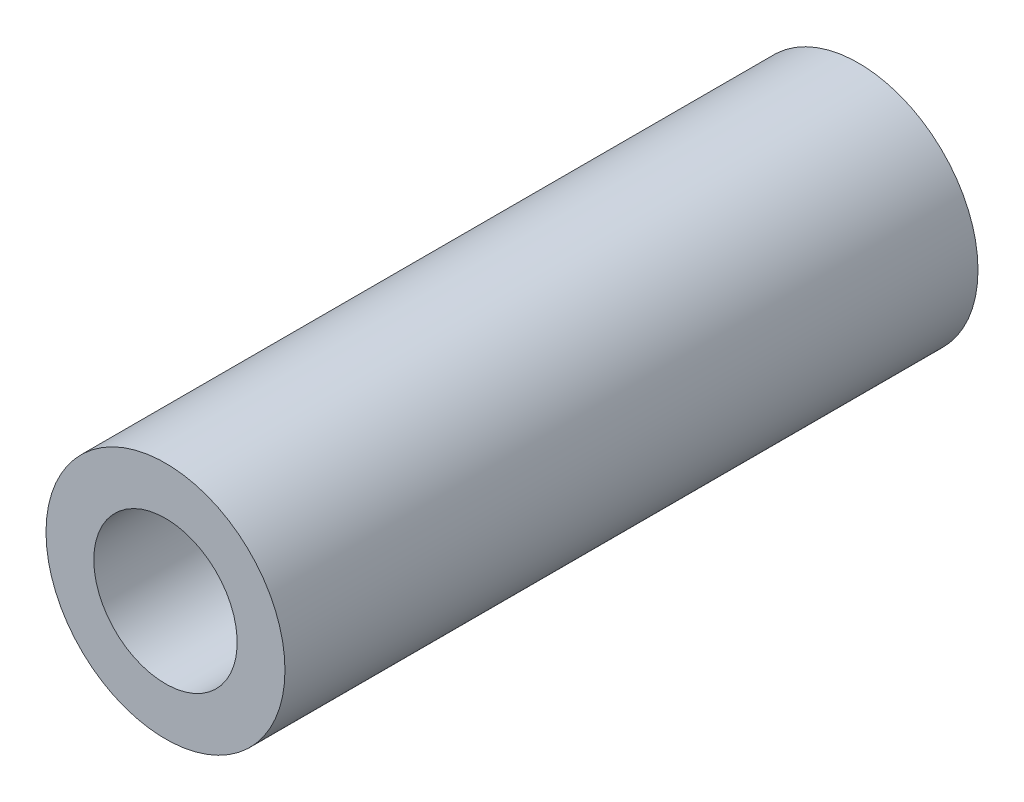
ISO-10303-21;
HEADER;
FILE_DESCRIPTION(('STEP AP214'),'2;1');
FILE_NAME('part.step','',(''),(''),'','','');
FILE_SCHEMA(('AUTOMOTIVE_DESIGN { 1 0 10303 214 1 1 1 1 }'));
ENDSEC;
DATA;
#1=APPLICATION_CONTEXT('core data for automotive mechanical design processes');
#2=APPLICATION_PROTOCOL_DEFINITION('international standard','automotive_design',2000,#1);
#3=PRODUCT_CONTEXT('',#1,'mechanical');
#4=PRODUCT('Part','Part','',(#3));
#5=PRODUCT_RELATED_PRODUCT_CATEGORY('part','',(#4));
#6=PRODUCT_DEFINITION_FORMATION('','',#4);
#7=PRODUCT_DEFINITION_CONTEXT('part definition',#1,'design');
#8=PRODUCT_DEFINITION('design','',#6,#7);
#9=PRODUCT_DEFINITION_SHAPE('','',#8);
#10=(LENGTH_UNIT() NAMED_UNIT(*) SI_UNIT(.MILLI.,.METRE.));
#11=(NAMED_UNIT(*) PLANE_ANGLE_UNIT() SI_UNIT($,.RADIAN.));
#12=(NAMED_UNIT(*) SI_UNIT($,.STERADIAN.) SOLID_ANGLE_UNIT());
#13=UNCERTAINTY_MEASURE_WITH_UNIT(LENGTH_MEASURE(1.E-05),#10,'distance_accuracy_value','');
#14=(GEOMETRIC_REPRESENTATION_CONTEXT(3) GLOBAL_UNCERTAINTY_ASSIGNED_CONTEXT((#13)) GLOBAL_UNIT_ASSIGNED_CONTEXT((#10,
#11,#12)) REPRESENTATION_CONTEXT('',''));
#15=CARTESIAN_POINT('',(0.,0.,0.));
#16=DIRECTION('',(0.,0.,1.));
#17=DIRECTION('',(1.,0.,0.));
#18=AXIS2_PLACEMENT_3D('',#15,#16,#17);
#19=CARTESIAN_POINT('',(0.,0.,29.));
#20=DIRECTION('',(0.,0.,1.));
#21=DIRECTION('',(1.,0.,0.));
#22=AXIS2_PLACEMENT_3D('',#19,#20,#21);
#23=PLANE('',#22);
#24=CARTESIAN_POINT('',(0.,0.,29.));
#25=DIRECTION('',(0.,0.,1.));
#26=DIRECTION('',(1.,0.,0.));
#27=AXIS2_PLACEMENT_3D('',#24,#25,#26);
#28=CIRCLE('',#27,5.);
#29=CARTESIAN_POINT('',(-5.,0.,29.));
#30=VERTEX_POINT('',#29);
#31=EDGE_CURVE('E10',#30,#30,#28,.T.);
#32=ORIENTED_EDGE('',*,*,#31,.T.);
#33=EDGE_LOOP('',(#32));
#34=FACE_BOUND('',#33,.T.);
#35=CARTESIAN_POINT('',(0.,0.,29.));
#36=DIRECTION('',(0.,0.,1.));
#37=DIRECTION('',(1.,0.,0.));
#38=AXIS2_PLACEMENT_3D('',#35,#36,#37);
#39=CIRCLE('',#38,3.);
#40=CARTESIAN_POINT('',(-3.,0.,29.));
#41=VERTEX_POINT('',#40);
#42=EDGE_CURVE('E52',#41,#41,#39,.T.);
#43=ORIENTED_EDGE('',*,*,#42,.F.);
#44=EDGE_LOOP('',(#43));
#45=FACE_BOUND('',#44,.T.);
#46=ADVANCED_FACE('F38',(#34,#45),#23,.T.);
#47=CARTESIAN_POINT('',(0.,0.,0.));
#48=DIRECTION('',(0.,0.,1.));
#49=DIRECTION('',(1.,0.,0.));
#50=AXIS2_PLACEMENT_3D('',#47,#48,#49);
#51=PLANE('',#50);
#52=CARTESIAN_POINT('',(0.,0.,0.));
#53=DIRECTION('',(0.,0.,1.));
#54=DIRECTION('',(1.,0.,0.));
#55=AXIS2_PLACEMENT_3D('',#52,#53,#54);
#56=CIRCLE('',#55,5.);
#57=CARTESIAN_POINT('',(-5.,0.,0.));
#58=VERTEX_POINT('',#57);
#59=EDGE_CURVE('E42',#58,#58,#56,.T.);
#60=ORIENTED_EDGE('',*,*,#59,.F.);
#61=EDGE_LOOP('',(#60));
#62=FACE_BOUND('',#61,.T.);
#63=CARTESIAN_POINT('',(0.,0.,0.));
#64=DIRECTION('',(0.,0.,1.));
#65=DIRECTION('',(1.,0.,0.));
#66=AXIS2_PLACEMENT_3D('',#63,#64,#65);
#67=CIRCLE('',#66,3.);
#68=CARTESIAN_POINT('',(-3.,0.,0.));
#69=VERTEX_POINT('',#68);
#70=EDGE_CURVE('E54',#69,#69,#67,.T.);
#71=ORIENTED_EDGE('',*,*,#70,.T.);
#72=EDGE_LOOP('',(#71));
#73=FACE_BOUND('',#72,.T.);
#74=ADVANCED_FACE('F67',(#62,#73),#51,.F.);
#75=CARTESIAN_POINT('',(0.,0.,29.));
#76=DIRECTION('',(0.,0.,-1.));
#77=DIRECTION('',(-1.,0.,0.));
#78=AXIS2_PLACEMENT_3D('',#75,#76,#77);
#79=CYLINDRICAL_SURFACE('',#78,5.);
#80=CARTESIAN_POINT('',(-5.,0.,29.));
#81=CARTESIAN_POINT('',(-5.,0.,28.6979166666667));
#82=CARTESIAN_POINT('',(-5.,0.,28.3958333333333));
#83=CARTESIAN_POINT('',(-5.,0.,27.7916666666667));
#84=CARTESIAN_POINT('',(-5.,0.,27.4895833333333));
#85=CARTESIAN_POINT('',(-5.,0.,26.8854166666667));
#86=CARTESIAN_POINT('',(-5.,0.,26.5833333333333));
#87=CARTESIAN_POINT('',(-5.,0.,25.9791666666667));
#88=CARTESIAN_POINT('',(-5.,0.,25.6770833333333));
#89=CARTESIAN_POINT('',(-5.,0.,25.0729166666667));
#90=CARTESIAN_POINT('',(-5.,0.,24.7708333333333));
#91=CARTESIAN_POINT('',(-5.,0.,24.1666666666667));
#92=CARTESIAN_POINT('',(-5.,0.,23.8645833333333));
#93=CARTESIAN_POINT('',(-5.,0.,23.2604166666667));
#94=CARTESIAN_POINT('',(-5.,0.,22.9583333333333));
#95=CARTESIAN_POINT('',(-5.,0.,22.3541666666667));
#96=CARTESIAN_POINT('',(-5.,0.,22.0520833333333));
#97=CARTESIAN_POINT('',(-5.,0.,21.4479166666667));
#98=CARTESIAN_POINT('',(-5.,0.,21.1458333333333));
#99=CARTESIAN_POINT('',(-5.,0.,20.5416666666667));
#100=CARTESIAN_POINT('',(-5.,0.,20.2395833333333));
#101=CARTESIAN_POINT('',(-5.,0.,19.6354166666667));
#102=CARTESIAN_POINT('',(-5.,0.,19.3333333333333));
#103=CARTESIAN_POINT('',(-5.,0.,18.7291666666667));
#104=CARTESIAN_POINT('',(-5.,0.,18.4270833333333));
#105=CARTESIAN_POINT('',(-5.,0.,17.8229166666667));
#106=CARTESIAN_POINT('',(-5.,0.,17.5208333333333));
#107=CARTESIAN_POINT('',(-5.,0.,16.9166666666667));
#108=CARTESIAN_POINT('',(-5.,0.,16.6145833333333));
#109=CARTESIAN_POINT('',(-5.,0.,16.0104166666667));
#110=CARTESIAN_POINT('',(-5.,0.,15.7083333333333));
#111=CARTESIAN_POINT('',(-5.,0.,15.1041666666667));
#112=CARTESIAN_POINT('',(-5.,0.,14.8020833333333));
#113=CARTESIAN_POINT('',(-5.,0.,14.1979166666667));
#114=CARTESIAN_POINT('',(-5.,0.,13.8958333333333));
#115=CARTESIAN_POINT('',(-5.,0.,13.2916666666667));
#116=CARTESIAN_POINT('',(-5.,0.,12.9895833333333));
#117=CARTESIAN_POINT('',(-5.,0.,12.3854166666667));
#118=CARTESIAN_POINT('',(-5.,0.,12.0833333333333));
#119=CARTESIAN_POINT('',(-5.,0.,11.4791666666667));
#120=CARTESIAN_POINT('',(-5.,0.,11.1770833333333));
#121=CARTESIAN_POINT('',(-5.,0.,10.5729166666667));
#122=CARTESIAN_POINT('',(-5.,0.,10.2708333333333));
#123=CARTESIAN_POINT('',(-5.,0.,9.66666666666667));
#124=CARTESIAN_POINT('',(-5.,0.,9.36458333333333));
#125=CARTESIAN_POINT('',(-5.,0.,8.76041666666667));
#126=CARTESIAN_POINT('',(-5.,0.,8.45833333333333));
#127=CARTESIAN_POINT('',(-5.,0.,7.85416666666667));
#128=CARTESIAN_POINT('',(-5.,0.,7.55208333333333));
#129=CARTESIAN_POINT('',(-5.,0.,6.94791666666667));
#130=CARTESIAN_POINT('',(-5.,0.,6.64583333333333));
#131=CARTESIAN_POINT('',(-5.,0.,6.04166666666667));
#132=CARTESIAN_POINT('',(-5.,0.,5.73958333333333));
#133=CARTESIAN_POINT('',(-5.,0.,5.13541666666667));
#134=CARTESIAN_POINT('',(-5.,0.,4.83333333333333));
#135=CARTESIAN_POINT('',(-5.,0.,4.22916666666667));
#136=CARTESIAN_POINT('',(-5.,0.,3.92708333333333));
#137=CARTESIAN_POINT('',(-5.,0.,3.32291666666667));
#138=CARTESIAN_POINT('',(-5.,0.,3.02083333333333));
#139=CARTESIAN_POINT('',(-5.,0.,2.41666666666667));
#140=CARTESIAN_POINT('',(-5.,0.,2.11458333333333));
#141=CARTESIAN_POINT('',(-5.,0.,1.51041666666667));
#142=CARTESIAN_POINT('',(-5.,0.,1.20833333333333));
#143=CARTESIAN_POINT('',(-5.,0.,0.604166666666667));
#144=CARTESIAN_POINT('',(-5.,0.,0.302083333333333));
#145=CARTESIAN_POINT('',(-5.,0.,0.));
#146=B_SPLINE_CURVE_WITH_KNOTS('',3,(#80,#81,#82,#83,#84,#85,#86,#87,#88,#89,#90,#91,#92,#93,
#94,#95,#96,#97,#98,#99,#100,#101,#102,#103,#104,#105,#106,#107,#108,#109,#110,#111,#112,#113,
#114,#115,#116,#117,#118,#119,#120,#121,#122,#123,#124,#125,#126,#127,#128,#129,#130,#131,#132,
#133,#134,#135,#136,#137,#138,#139,#140,#141,#142,#143,#144,#145),.UNSPECIFIED.,.F.,.F.,(4,2,2,
2,2,2,2,2,2,2,2,2,2,2,2,2,2,2,2,2,2,2,2,2,2,2,2,2,2,2,2,2,4),(0.,0.906249999999997,1.8125,
2.71875,3.625,4.53125,5.4375,6.34375,7.25,8.15625,9.0625,9.96875,10.875,11.78125,12.6875,
13.59375,14.5,15.40625,16.3125,17.21875,18.125,19.03125,19.9375,20.84375,21.75,22.65625,23.5625,
24.46875,25.375,26.28125,27.1875,28.09375,29.),.UNSPECIFIED.);
#147=EDGE_CURVE('BSEAM40',#30,#58,#146,.T.);
#148=ORIENTED_EDGE('',*,*,#31,.F.);
#149=ORIENTED_EDGE('',*,*,#59,.T.);
#150=ORIENTED_EDGE('',*,*,#147,.T.);
#151=ORIENTED_EDGE('',*,*,#147,.F.);
#152=EDGE_LOOP('',(#148,#150,#149,#151));
#153=FACE_BOUND('',#152,.T.);
#154=ADVANCED_FACE('F40',(#153),#79,.T.);
#155=CARTESIAN_POINT('',(0.,0.,29.));
#156=DIRECTION('',(0.,0.,-1.));
#157=DIRECTION('',(-1.,0.,0.));
#158=AXIS2_PLACEMENT_3D('',#155,#156,#157);
#159=CYLINDRICAL_SURFACE('',#158,3.);
#160=CARTESIAN_POINT('',(-3.,0.,29.));
#161=CARTESIAN_POINT('',(-3.,0.,28.6979166666667));
#162=CARTESIAN_POINT('',(-3.,0.,28.3958333333333));
#163=CARTESIAN_POINT('',(-3.,0.,27.7916666666667));
#164=CARTESIAN_POINT('',(-3.,0.,27.4895833333333));
#165=CARTESIAN_POINT('',(-3.,0.,26.8854166666667));
#166=CARTESIAN_POINT('',(-3.,0.,26.5833333333333));
#167=CARTESIAN_POINT('',(-3.,0.,25.9791666666667));
#168=CARTESIAN_POINT('',(-3.,0.,25.6770833333333));
#169=CARTESIAN_POINT('',(-3.,0.,25.0729166666667));
#170=CARTESIAN_POINT('',(-3.,0.,24.7708333333333));
#171=CARTESIAN_POINT('',(-3.,0.,24.1666666666667));
#172=CARTESIAN_POINT('',(-3.,0.,23.8645833333333));
#173=CARTESIAN_POINT('',(-3.,0.,23.2604166666667));
#174=CARTESIAN_POINT('',(-3.,0.,22.9583333333333));
#175=CARTESIAN_POINT('',(-3.,0.,22.3541666666667));
#176=CARTESIAN_POINT('',(-3.,0.,22.0520833333333));
#177=CARTESIAN_POINT('',(-3.,0.,21.4479166666667));
#178=CARTESIAN_POINT('',(-3.,0.,21.1458333333333));
#179=CARTESIAN_POINT('',(-3.,0.,20.5416666666667));
#180=CARTESIAN_POINT('',(-3.,0.,20.2395833333333));
#181=CARTESIAN_POINT('',(-3.,0.,19.6354166666667));
#182=CARTESIAN_POINT('',(-3.,0.,19.3333333333333));
#183=CARTESIAN_POINT('',(-3.,0.,18.7291666666667));
#184=CARTESIAN_POINT('',(-3.,0.,18.4270833333333));
#185=CARTESIAN_POINT('',(-3.,0.,17.8229166666667));
#186=CARTESIAN_POINT('',(-3.,0.,17.5208333333333));
#187=CARTESIAN_POINT('',(-3.,0.,16.9166666666667));
#188=CARTESIAN_POINT('',(-3.,0.,16.6145833333333));
#189=CARTESIAN_POINT('',(-3.,0.,16.0104166666667));
#190=CARTESIAN_POINT('',(-3.,0.,15.7083333333333));
#191=CARTESIAN_POINT('',(-3.,0.,15.1041666666667));
#192=CARTESIAN_POINT('',(-3.,0.,14.8020833333333));
#193=CARTESIAN_POINT('',(-3.,0.,14.1979166666667));
#194=CARTESIAN_POINT('',(-3.,0.,13.8958333333333));
#195=CARTESIAN_POINT('',(-3.,0.,13.2916666666667));
#196=CARTESIAN_POINT('',(-3.,0.,12.9895833333333));
#197=CARTESIAN_POINT('',(-3.,0.,12.3854166666667));
#198=CARTESIAN_POINT('',(-3.,0.,12.0833333333333));
#199=CARTESIAN_POINT('',(-3.,0.,11.4791666666667));
#200=CARTESIAN_POINT('',(-3.,0.,11.1770833333333));
#201=CARTESIAN_POINT('',(-3.,0.,10.5729166666667));
#202=CARTESIAN_POINT('',(-3.,0.,10.2708333333333));
#203=CARTESIAN_POINT('',(-3.,0.,9.66666666666667));
#204=CARTESIAN_POINT('',(-3.,0.,9.36458333333333));
#205=CARTESIAN_POINT('',(-3.,0.,8.76041666666667));
#206=CARTESIAN_POINT('',(-3.,0.,8.45833333333333));
#207=CARTESIAN_POINT('',(-3.,0.,7.85416666666667));
#208=CARTESIAN_POINT('',(-3.,0.,7.55208333333333));
#209=CARTESIAN_POINT('',(-3.,0.,6.94791666666667));
#210=CARTESIAN_POINT('',(-3.,0.,6.64583333333333));
#211=CARTESIAN_POINT('',(-3.,0.,6.04166666666667));
#212=CARTESIAN_POINT('',(-3.,0.,5.73958333333333));
#213=CARTESIAN_POINT('',(-3.,0.,5.13541666666667));
#214=CARTESIAN_POINT('',(-3.,0.,4.83333333333333));
#215=CARTESIAN_POINT('',(-3.,0.,4.22916666666667));
#216=CARTESIAN_POINT('',(-3.,0.,3.92708333333333));
#217=CARTESIAN_POINT('',(-3.,0.,3.32291666666667));
#218=CARTESIAN_POINT('',(-3.,0.,3.02083333333333));
#219=CARTESIAN_POINT('',(-3.,0.,2.41666666666667));
#220=CARTESIAN_POINT('',(-3.,0.,2.11458333333333));
#221=CARTESIAN_POINT('',(-3.,0.,1.51041666666667));
#222=CARTESIAN_POINT('',(-3.,0.,1.20833333333333));
#223=CARTESIAN_POINT('',(-3.,0.,0.604166666666667));
#224=CARTESIAN_POINT('',(-3.,0.,0.302083333333333));
#225=CARTESIAN_POINT('',(-3.,0.,0.));
#226=B_SPLINE_CURVE_WITH_KNOTS('',3,(#160,#161,#162,#163,#164,#165,#166,#167,#168,#169,#170,
#171,#172,#173,#174,#175,#176,#177,#178,#179,#180,#181,#182,#183,#184,#185,#186,#187,#188,#189,
#190,#191,#192,#193,#194,#195,#196,#197,#198,#199,#200,#201,#202,#203,#204,#205,#206,#207,#208,
#209,#210,#211,#212,#213,#214,#215,#216,#217,#218,#219,#220,#221,#222,#223,#224,#225),
.UNSPECIFIED.,.F.,.F.,(4,2,2,2,2,2,2,2,2,2,2,2,2,2,2,2,2,2,2,2,2,2,2,2,2,2,2,2,2,2,2,2,4),(0.,
0.906249999999997,1.8125,2.71875,3.625,4.53125,5.4375,6.34375,7.25,8.15625,9.0625,9.96875,
10.875,11.78125,12.6875,13.59375,14.5,15.40625,16.3125,17.21875,18.125,19.03125,19.9375,
20.84375,21.75,22.65625,23.5625,24.46875,25.375,26.28125,27.1875,28.09375,29.),.UNSPECIFIED.);
#227=EDGE_CURVE('BSEAM63',#41,#69,#226,.T.);
#228=ORIENTED_EDGE('',*,*,#42,.T.);
#229=ORIENTED_EDGE('',*,*,#70,.F.);
#230=ORIENTED_EDGE('',*,*,#227,.T.);
#231=ORIENTED_EDGE('',*,*,#227,.F.);
#232=EDGE_LOOP('',(#228,#230,#229,#231));
#233=FACE_BOUND('',#232,.T.);
#234=ADVANCED_FACE('F63',(#233),#159,.F.);
#235=CLOSED_SHELL('',(#46,#74,#154,#234));
#236=MANIFOLD_SOLID_BREP('B2',#235);
#237=ADVANCED_BREP_SHAPE_REPRESENTATION('',(#18,#236),#14);
#238=SHAPE_DEFINITION_REPRESENTATION(#9,#237);
ENDSEC;
END-ISO-10303-21;
